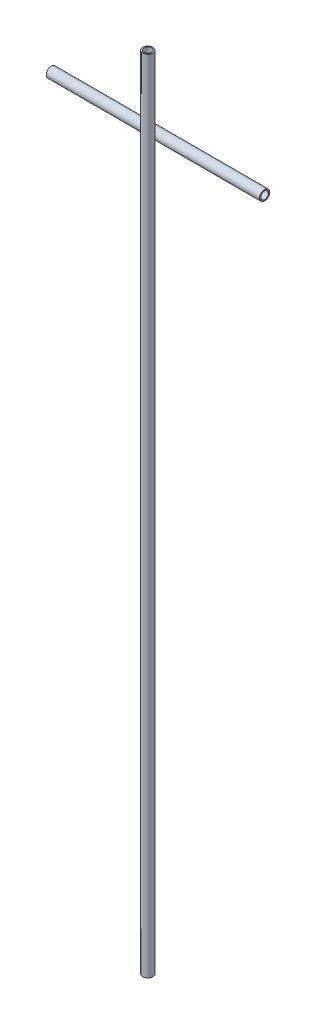
ISO-10303-21;
HEADER;
FILE_DESCRIPTION(('STEP AP214'),'2;1');
FILE_NAME('part.step','',(''),(''),'','','');
FILE_SCHEMA(('AUTOMOTIVE_DESIGN { 1 0 10303 214 1 1 1 1 }'));
ENDSEC;
DATA;
#1=APPLICATION_CONTEXT('core data for automotive mechanical design processes');
#2=APPLICATION_PROTOCOL_DEFINITION('international standard','automotive_design',2000,#1);
#3=PRODUCT_CONTEXT('',#1,'mechanical');
#4=PRODUCT('Part','Part','',(#3));
#5=PRODUCT_RELATED_PRODUCT_CATEGORY('part','',(#4));
#6=PRODUCT_DEFINITION_FORMATION('','',#4);
#7=PRODUCT_DEFINITION_CONTEXT('part definition',#1,'design');
#8=PRODUCT_DEFINITION('design','',#6,#7);
#9=PRODUCT_DEFINITION_SHAPE('','',#8);
#10=(LENGTH_UNIT() NAMED_UNIT(*) SI_UNIT(.MILLI.,.METRE.));
#11=(NAMED_UNIT(*) PLANE_ANGLE_UNIT() SI_UNIT($,.RADIAN.));
#12=(NAMED_UNIT(*) SI_UNIT($,.STERADIAN.) SOLID_ANGLE_UNIT());
#13=UNCERTAINTY_MEASURE_WITH_UNIT(LENGTH_MEASURE(1.E-05),#10,'distance_accuracy_value','');
#14=(GEOMETRIC_REPRESENTATION_CONTEXT(3) GLOBAL_UNCERTAINTY_ASSIGNED_CONTEXT((#13)) GLOBAL_UNIT_ASSIGNED_CONTEXT((#10,
#11,#12)) REPRESENTATION_CONTEXT('',''));
#15=CARTESIAN_POINT('',(0.,0.,0.));
#16=DIRECTION('',(0.,0.,1.));
#17=DIRECTION('',(1.,0.,0.));
#18=AXIS2_PLACEMENT_3D('',#15,#16,#17);
#19=CARTESIAN_POINT('',(-200.,355.,80.95));
#20=DIRECTION('',(1.,0.,0.));
#21=DIRECTION('',(0.,0.,-1.));
#22=AXIS2_PLACEMENT_3D('',#19,#20,#21);
#23=CYLINDRICAL_SURFACE('',#22,9.525);
#24=CARTESIAN_POINT('',(-200.,355.,80.95));
#25=DIRECTION('',(1.,0.,0.));
#26=DIRECTION('',(0.,0.,-1.));
#27=AXIS2_PLACEMENT_3D('',#24,#25,#26);
#28=CIRCLE('',#27,9.525);
#29=CARTESIAN_POINT('',(-200.,355.,71.425));
#30=VERTEX_POINT('',#29);
#31=EDGE_CURVE('E11',#30,#30,#28,.T.);
#32=ORIENTED_EDGE('',*,*,#31,.T.);
#33=EDGE_LOOP('',(#32));
#34=FACE_BOUND('',#33,.T.);
#35=CARTESIAN_POINT('',(200.,355.,80.95));
#36=DIRECTION('',(1.,0.,0.));
#37=DIRECTION('',(0.,0.,-1.));
#38=AXIS2_PLACEMENT_3D('',#35,#36,#37);
#39=CIRCLE('',#38,9.525);
#40=CARTESIAN_POINT('',(200.,355.,71.425));
#41=VERTEX_POINT('',#40);
#42=EDGE_CURVE('E53',#41,#41,#39,.T.);
#43=ORIENTED_EDGE('',*,*,#42,.F.);
#44=EDGE_LOOP('',(#43));
#45=FACE_BOUND('',#44,.T.);
#46=ADVANCED_FACE('F43',(#34,#45),#23,.T.);
#47=CARTESIAN_POINT('',(-200.,355.,80.95));
#48=DIRECTION('',(1.,0.,0.));
#49=DIRECTION('',(0.,0.,-1.));
#50=AXIS2_PLACEMENT_3D('',#47,#48,#49);
#51=PLANE('',#50);
#52=CARTESIAN_POINT('',(-200.,355.,80.95));
#53=DIRECTION('',(1.,0.,0.));
#54=DIRECTION('',(0.,0.,-1.));
#55=AXIS2_PLACEMENT_3D('',#52,#53,#54);
#56=CIRCLE('',#55,7.27499999999998);
#57=CARTESIAN_POINT('',(-200.,355.,73.675));
#58=VERTEX_POINT('',#57);
#59=EDGE_CURVE('E49',#58,#58,#56,.T.);
#60=ORIENTED_EDGE('',*,*,#59,.T.);
#61=EDGE_LOOP('',(#60));
#62=FACE_BOUND('',#61,.T.);
#63=ORIENTED_EDGE('',*,*,#31,.F.);
#64=EDGE_LOOP('',(#63));
#65=FACE_BOUND('',#64,.T.);
#66=ADVANCED_FACE('F72',(#62,#65),#51,.F.);
#67=CARTESIAN_POINT('',(-200.,355.,80.95));
#68=DIRECTION('',(1.,0.,0.));
#69=DIRECTION('',(0.,0.,-1.));
#70=AXIS2_PLACEMENT_3D('',#67,#68,#69);
#71=CYLINDRICAL_SURFACE('',#70,7.27499999999998);
#72=ORIENTED_EDGE('',*,*,#59,.F.);
#73=EDGE_LOOP('',(#72));
#74=FACE_BOUND('',#73,.T.);
#75=CARTESIAN_POINT('',(200.,355.,80.95));
#76=DIRECTION('',(1.,0.,0.));
#77=DIRECTION('',(0.,0.,-1.));
#78=AXIS2_PLACEMENT_3D('',#75,#76,#77);
#79=CIRCLE('',#78,7.27499999999998);
#80=CARTESIAN_POINT('',(200.,355.,73.675));
#81=VERTEX_POINT('',#80);
#82=EDGE_CURVE('E57',#81,#81,#79,.T.);
#83=ORIENTED_EDGE('',*,*,#82,.T.);
#84=EDGE_LOOP('',(#83));
#85=FACE_BOUND('',#84,.T.);
#86=ADVANCED_FACE('F63',(#74,#85),#71,.F.);
#87=CARTESIAN_POINT('',(200.,355.,80.95));
#88=DIRECTION('',(1.,0.,0.));
#89=DIRECTION('',(0.,0.,-1.));
#90=AXIS2_PLACEMENT_3D('',#87,#88,#89);
#91=PLANE('',#90);
#92=ORIENTED_EDGE('',*,*,#42,.T.);
#93=EDGE_LOOP('',(#92));
#94=FACE_BOUND('',#93,.T.);
#95=ORIENTED_EDGE('',*,*,#82,.F.);
#96=EDGE_LOOP('',(#95));
#97=FACE_BOUND('',#96,.T.);
#98=ADVANCED_FACE('F65',(#94,#97),#91,.T.);
#99=CLOSED_SHELL('',(#46,#66,#86,#98));
#100=MANIFOLD_SOLID_BREP('B2',#99);
#101=CARTESIAN_POINT('',(0.,-1000.,100.));
#102=DIRECTION('',(0.,1.,0.));
#103=DIRECTION('',(0.,0.,1.));
#104=AXIS2_PLACEMENT_3D('',#101,#102,#103);
#105=CYLINDRICAL_SURFACE('',#104,9.525);
#106=CARTESIAN_POINT('',(0.,-1000.,100.));
#107=DIRECTION('',(0.,1.,0.));
#108=DIRECTION('',(0.,0.,1.));
#109=AXIS2_PLACEMENT_3D('',#106,#107,#108);
#110=CIRCLE('',#109,9.525);
#111=CARTESIAN_POINT('',(0.,-1000.,109.525));
#112=VERTEX_POINT('',#111);
#113=EDGE_CURVE('E42',#112,#112,#110,.T.);
#114=ORIENTED_EDGE('',*,*,#113,.T.);
#115=EDGE_LOOP('',(#114));
#116=FACE_BOUND('',#115,.T.);
#117=CARTESIAN_POINT('',(0.,500.,100.));
#118=DIRECTION('',(0.,1.,0.));
#119=DIRECTION('',(0.,0.,1.));
#120=AXIS2_PLACEMENT_3D('',#117,#118,#119);
#121=CIRCLE('',#120,9.525);
#122=CARTESIAN_POINT('',(0.,500.,109.525));
#123=VERTEX_POINT('',#122);
#124=EDGE_CURVE('E123',#123,#123,#121,.T.);
#125=ORIENTED_EDGE('',*,*,#124,.F.);
#126=EDGE_LOOP('',(#125));
#127=FACE_BOUND('',#126,.T.);
#128=ADVANCED_FACE('F113',(#116,#127),#105,.T.);
#129=CARTESIAN_POINT('',(0.,-1000.,100.));
#130=DIRECTION('',(0.,1.,0.));
#131=DIRECTION('',(0.,0.,1.));
#132=AXIS2_PLACEMENT_3D('',#129,#130,#131);
#133=PLANE('',#132);
#134=CARTESIAN_POINT('',(0.,-1000.,100.));
#135=DIRECTION('',(0.,1.,0.));
#136=DIRECTION('',(0.,0.,1.));
#137=AXIS2_PLACEMENT_3D('',#134,#135,#136);
#138=CIRCLE('',#137,7.275);
#139=CARTESIAN_POINT('',(0.,-1000.,107.275));
#140=VERTEX_POINT('',#139);
#141=EDGE_CURVE('E119',#140,#140,#138,.T.);
#142=ORIENTED_EDGE('',*,*,#141,.T.);
#143=EDGE_LOOP('',(#142));
#144=FACE_BOUND('',#143,.T.);
#145=ORIENTED_EDGE('',*,*,#113,.F.);
#146=EDGE_LOOP('',(#145));
#147=FACE_BOUND('',#146,.T.);
#148=ADVANCED_FACE('F142',(#144,#147),#133,.F.);
#149=CARTESIAN_POINT('',(0.,-1000.,100.));
#150=DIRECTION('',(0.,1.,0.));
#151=DIRECTION('',(0.,0.,1.));
#152=AXIS2_PLACEMENT_3D('',#149,#150,#151);
#153=CYLINDRICAL_SURFACE('',#152,7.275);
#154=ORIENTED_EDGE('',*,*,#141,.F.);
#155=EDGE_LOOP('',(#154));
#156=FACE_BOUND('',#155,.T.);
#157=CARTESIAN_POINT('',(0.,500.,100.));
#158=DIRECTION('',(0.,1.,0.));
#159=DIRECTION('',(0.,0.,1.));
#160=AXIS2_PLACEMENT_3D('',#157,#158,#159);
#161=CIRCLE('',#160,7.275);
#162=CARTESIAN_POINT('',(0.,500.,107.275));
#163=VERTEX_POINT('',#162);
#164=EDGE_CURVE('E127',#163,#163,#161,.T.);
#165=ORIENTED_EDGE('',*,*,#164,.T.);
#166=EDGE_LOOP('',(#165));
#167=FACE_BOUND('',#166,.T.);
#168=ADVANCED_FACE('F133',(#156,#167),#153,.F.);
#169=CARTESIAN_POINT('',(0.,500.,100.));
#170=DIRECTION('',(0.,1.,0.));
#171=DIRECTION('',(0.,0.,1.));
#172=AXIS2_PLACEMENT_3D('',#169,#170,#171);
#173=PLANE('',#172);
#174=ORIENTED_EDGE('',*,*,#124,.T.);
#175=EDGE_LOOP('',(#174));
#176=FACE_BOUND('',#175,.T.);
#177=ORIENTED_EDGE('',*,*,#164,.F.);
#178=EDGE_LOOP('',(#177));
#179=FACE_BOUND('',#178,.T.);
#180=ADVANCED_FACE('F135',(#176,#179),#173,.T.);
#181=CLOSED_SHELL('',(#128,#148,#168,#180));
#182=MANIFOLD_SOLID_BREP('B6',#181);
#183=ADVANCED_BREP_SHAPE_REPRESENTATION('',(#18,#100,#182),#14);
#184=SHAPE_DEFINITION_REPRESENTATION(#9,#183);
ENDSEC;
END-ISO-10303-21;
